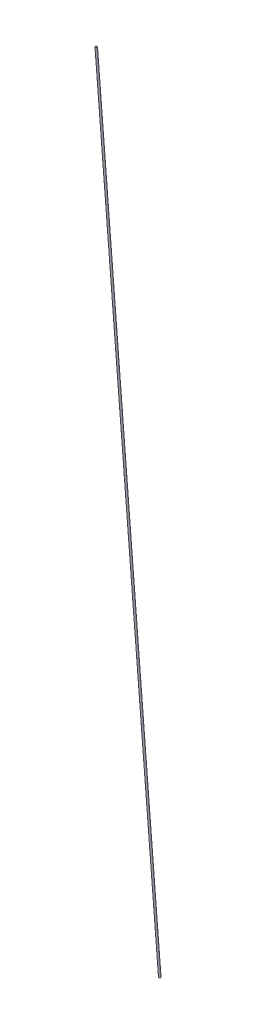
ISO-10303-21;
HEADER;
FILE_DESCRIPTION(('STEP AP214'),'2;1');
FILE_NAME('part.step','',(''),(''),'','','');
FILE_SCHEMA(('AUTOMOTIVE_DESIGN { 1 0 10303 214 1 1 1 1 }'));
ENDSEC;
DATA;
#1=APPLICATION_CONTEXT('core data for automotive mechanical design processes');
#2=APPLICATION_PROTOCOL_DEFINITION('international standard','automotive_design',2000,#1);
#3=PRODUCT_CONTEXT('',#1,'mechanical');
#4=PRODUCT('Part','Part','',(#3));
#5=PRODUCT_RELATED_PRODUCT_CATEGORY('part','',(#4));
#6=PRODUCT_DEFINITION_FORMATION('','',#4);
#7=PRODUCT_DEFINITION_CONTEXT('part definition',#1,'design');
#8=PRODUCT_DEFINITION('design','',#6,#7);
#9=PRODUCT_DEFINITION_SHAPE('','',#8);
#10=(LENGTH_UNIT() NAMED_UNIT(*) SI_UNIT(.MILLI.,.METRE.));
#11=(NAMED_UNIT(*) PLANE_ANGLE_UNIT() SI_UNIT($,.RADIAN.));
#12=(NAMED_UNIT(*) SI_UNIT($,.STERADIAN.) SOLID_ANGLE_UNIT());
#13=UNCERTAINTY_MEASURE_WITH_UNIT(LENGTH_MEASURE(1.E-05),#10,'distance_accuracy_value','');
#14=(GEOMETRIC_REPRESENTATION_CONTEXT(3) GLOBAL_UNCERTAINTY_ASSIGNED_CONTEXT((#13)) GLOBAL_UNIT_ASSIGNED_CONTEXT((#10,
#11,#12)) REPRESENTATION_CONTEXT('',''));
#15=CARTESIAN_POINT('',(0.,0.,0.));
#16=DIRECTION('',(0.,0.,1.));
#17=DIRECTION('',(1.,0.,0.));
#18=AXIS2_PLACEMENT_3D('',#15,#16,#17);
#19=CARTESIAN_POINT('',(0.,0.,0.));
#20=DIRECTION('',(0.,1.,0.));
#21=DIRECTION('',(0.,0.,1.));
#22=AXIS2_PLACEMENT_3D('',#19,#20,#21);
#23=PLANE('',#22);
#24=CARTESIAN_POINT('',(0.,0.,0.));
#25=DIRECTION('',(0.,1.,0.));
#26=DIRECTION('',(0.,0.,1.));
#27=AXIS2_PLACEMENT_3D('',#24,#25,#26);
#28=CIRCLE('',#27,2.);
#29=CARTESIAN_POINT('',(0.,0.,2.));
#30=VERTEX_POINT('',#29);
#31=EDGE_CURVE('E44',#30,#30,#28,.T.);
#32=ORIENTED_EDGE('',*,*,#31,.T.);
#33=EDGE_LOOP('',(#32));
#34=FACE_BOUND('',#33,.T.);
#35=ADVANCED_FACE('F37',(#34),#23,.T.);
#36=CARTESIAN_POINT('',(141.,-1718.,0.));
#37=DIRECTION('',(0.,1.,0.));
#38=DIRECTION('',(0.,0.,1.));
#39=AXIS2_PLACEMENT_3D('',#36,#37,#38);
#40=PLANE('',#39);
#41=CARTESIAN_POINT('',(141.,-1718.,0.));
#42=DIRECTION('',(0.,1.,0.));
#43=DIRECTION('',(0.,0.,1.));
#44=AXIS2_PLACEMENT_3D('',#41,#42,#43);
#45=CIRCLE('',#44,2.);
#46=CARTESIAN_POINT('',(141.,-1718.,2.));
#47=VERTEX_POINT('',#46);
#48=EDGE_CURVE('E10',#47,#47,#45,.T.);
#49=ORIENTED_EDGE('',*,*,#48,.F.);
#50=EDGE_LOOP('',(#49));
#51=FACE_BOUND('',#50,.T.);
#52=ADVANCED_FACE('F54',(#51),#40,.F.);
#53=CARTESIAN_POINT('',(0.,0.,2.));
#54=CARTESIAN_POINT('',(141.,-1718.,2.));
#55=CARTESIAN_POINT('',(4.,0.,2.));
#56=CARTESIAN_POINT('',(145.,-1718.,2.));
#57=CARTESIAN_POINT('',(4.,0.,-2.));
#58=CARTESIAN_POINT('',(145.,-1718.,-2.));
#59=CARTESIAN_POINT('',(0.,0.,-2.));
#60=CARTESIAN_POINT('',(141.,-1718.,-2.));
#61=CARTESIAN_POINT('',(-4.,0.,-2.));
#62=CARTESIAN_POINT('',(137.,-1718.,-2.));
#63=CARTESIAN_POINT('',(-4.,0.,2.));
#64=CARTESIAN_POINT('',(137.,-1718.,2.));
#65=CARTESIAN_POINT('',(0.,0.,2.));
#66=CARTESIAN_POINT('',(141.,-1718.,2.));
#67=(BOUNDED_SURFACE() B_SPLINE_SURFACE(3,1,((#53,#54),(#55,#56),(#57,#58),(#59,#60),(#61,#62),
(#63,#64),(#65,#66)),.UNSPECIFIED.,.T.,.F.,.F.) B_SPLINE_SURFACE_WITH_KNOTS((4,3,4),(2,2),(0.,
0.5,1.),(0.,1.),.UNSPECIFIED.) GEOMETRIC_REPRESENTATION_ITEM() RATIONAL_B_SPLINE_SURFACE(((1.,
1.),(0.333333333333333,0.333333333333333),(0.333333333333333,0.333333333333333),(1.,1.),
(0.333333333333333,0.333333333333333),(0.333333333333333,0.333333333333333),(1.,1.))) REPRESENTATION_ITEM('') SURFACE());
#68=CARTESIAN_POINT('',(141.,-1718.,2.));
#69=CARTESIAN_POINT('',(139.53125,-1700.10416666667,2.));
#70=CARTESIAN_POINT('',(138.0625,-1682.20833333333,2.));
#71=CARTESIAN_POINT('',(135.125,-1646.41666666667,2.));
#72=CARTESIAN_POINT('',(133.65625,-1628.52083333333,2.));
#73=CARTESIAN_POINT('',(130.71875,-1592.72916666667,2.));
#74=CARTESIAN_POINT('',(129.25,-1574.83333333333,2.));
#75=CARTESIAN_POINT('',(126.3125,-1539.04166666667,2.));
#76=CARTESIAN_POINT('',(124.84375,-1521.14583333333,2.));
#77=CARTESIAN_POINT('',(121.90625,-1485.35416666667,2.));
#78=CARTESIAN_POINT('',(120.4375,-1467.45833333333,2.));
#79=CARTESIAN_POINT('',(117.5,-1431.66666666667,2.));
#80=CARTESIAN_POINT('',(116.03125,-1413.77083333333,2.));
#81=CARTESIAN_POINT('',(113.09375,-1377.97916666667,2.));
#82=CARTESIAN_POINT('',(111.625,-1360.08333333333,2.));
#83=CARTESIAN_POINT('',(108.6875,-1324.29166666667,2.));
#84=CARTESIAN_POINT('',(107.21875,-1306.39583333333,2.));
#85=CARTESIAN_POINT('',(104.28125,-1270.60416666667,2.));
#86=CARTESIAN_POINT('',(102.8125,-1252.70833333333,2.));
#87=CARTESIAN_POINT('',(99.8750000000002,-1216.91666666667,2.));
#88=CARTESIAN_POINT('',(98.4062500000002,-1199.02083333333,2.));
#89=CARTESIAN_POINT('',(95.4687500000002,-1163.22916666667,2.));
#90=CARTESIAN_POINT('',(94.0000000000002,-1145.33333333333,2.));
#91=CARTESIAN_POINT('',(91.0625000000001,-1109.54166666667,2.));
#92=CARTESIAN_POINT('',(89.5937500000001,-1091.64583333333,2.));
#93=CARTESIAN_POINT('',(86.6562500000001,-1055.85416666667,2.));
#94=CARTESIAN_POINT('',(85.1875000000002,-1037.95833333333,2.));
#95=CARTESIAN_POINT('',(82.2500000000001,-1002.16666666667,2.));
#96=CARTESIAN_POINT('',(80.7812500000001,-984.270833333333,2.));
#97=CARTESIAN_POINT('',(77.8437500000001,-948.479166666667,2.));
#98=CARTESIAN_POINT('',(76.3750000000001,-930.583333333333,2.));
#99=CARTESIAN_POINT('',(73.4375000000001,-894.791666666667,2.));
#100=CARTESIAN_POINT('',(71.9687500000001,-876.895833333333,2.));
#101=CARTESIAN_POINT('',(69.0312500000001,-841.104166666667,2.));
#102=CARTESIAN_POINT('',(67.5625000000001,-823.208333333333,2.));
#103=CARTESIAN_POINT('',(64.6250000000001,-787.416666666667,2.));
#104=CARTESIAN_POINT('',(63.1562500000001,-769.520833333333,2.));
#105=CARTESIAN_POINT('',(60.2187500000001,-733.729166666667,2.));
#106=CARTESIAN_POINT('',(58.7500000000001,-715.833333333333,2.));
#107=CARTESIAN_POINT('',(55.8125000000001,-680.041666666667,2.));
#108=CARTESIAN_POINT('',(54.3437500000001,-662.145833333333,2.));
#109=CARTESIAN_POINT('',(51.4062500000001,-626.354166666667,2.));
#110=CARTESIAN_POINT('',(49.9375000000001,-608.458333333333,2.));
#111=CARTESIAN_POINT('',(47.0000000000001,-572.666666666667,2.));
#112=CARTESIAN_POINT('',(45.5312500000001,-554.770833333333,2.));
#113=CARTESIAN_POINT('',(42.5937500000001,-518.979166666667,2.));
#114=CARTESIAN_POINT('',(41.1250000000001,-501.083333333333,2.));
#115=CARTESIAN_POINT('',(38.1875000000001,-465.291666666667,2.));
#116=CARTESIAN_POINT('',(36.7187500000001,-447.395833333333,2.));
#117=CARTESIAN_POINT('',(33.7812500000001,-411.604166666667,2.));
#118=CARTESIAN_POINT('',(32.3125000000001,-393.708333333333,2.));
#119=CARTESIAN_POINT('',(29.375,-357.916666666667,2.));
#120=CARTESIAN_POINT('',(27.90625,-340.020833333333,2.));
#121=CARTESIAN_POINT('',(24.96875,-304.229166666667,2.));
#122=CARTESIAN_POINT('',(23.5,-286.333333333333,2.));
#123=CARTESIAN_POINT('',(20.5625,-250.541666666667,2.));
#124=CARTESIAN_POINT('',(19.09375,-232.645833333333,2.));
#125=CARTESIAN_POINT('',(16.15625,-196.854166666667,2.));
#126=CARTESIAN_POINT('',(14.6875,-178.958333333333,2.));
#127=CARTESIAN_POINT('',(11.75,-143.166666666667,2.));
#128=CARTESIAN_POINT('',(10.28125,-125.270833333333,2.));
#129=CARTESIAN_POINT('',(7.34375000000001,-89.4791666666667,2.));
#130=CARTESIAN_POINT('',(5.87500000000001,-71.5833333333333,2.));
#131=CARTESIAN_POINT('',(2.93750000000001,-35.7916666666667,2.));
#132=CARTESIAN_POINT('',(1.46875,-17.8958333333333,2.));
#133=CARTESIAN_POINT('',(0.,0.,2.));
#134=B_SPLINE_CURVE_WITH_KNOTS('',3,(#68,#69,#70,#71,#72,#73,#74,#75,#76,#77,#78,#79,#80,#81,
#82,#83,#84,#85,#86,#87,#88,#89,#90,#91,#92,#93,#94,#95,#96,#97,#98,#99,#100,#101,#102,#103,
#104,#105,#106,#107,#108,#109,#110,#111,#112,#113,#114,#115,#116,#117,#118,#119,#120,#121,#122,
#123,#124,#125,#126,#127,#128,#129,#130,#131,#132,#133),.UNSPECIFIED.,.F.,.F.,(4,2,2,2,2,2,2,2,
2,2,2,2,2,2,2,2,2,2,2,2,2,2,2,2,2,2,2,2,2,2,2,2,4),(0.,53.8680118002559,107.736023600512,
161.604035400768,215.472047201023,269.340059001279,323.208070801535,377.076082601791,
430.944094402046,484.812106202302,538.680118002558,592.548129802814,646.41614160307,
700.284153403326,754.152165203581,808.020177003837,861.888188804093,915.756200604349,
969.624212404605,1023.49222420486,1077.36023600512,1131.22824780537,1185.09625960563,
1238.96427140588,1292.83228320614,1346.7002950064,1400.56830680665,1454.43631860691,
1508.30433040716,1562.17234220742,1616.04035400768,1669.90836580793,1723.77637760819),.UNSPECIFIED.);
#135=EDGE_CURVE('BSEAM52',#47,#30,#134,.T.);
#136=ORIENTED_EDGE('',*,*,#48,.T.);
#137=ORIENTED_EDGE('',*,*,#31,.F.);
#138=ORIENTED_EDGE('',*,*,#135,.T.);
#139=ORIENTED_EDGE('',*,*,#135,.F.);
#140=EDGE_LOOP('',(#136,#138,#137,#139));
#141=FACE_BOUND('',#140,.T.);
#142=ADVANCED_FACE('F52',(#141),#67,.F.);
#143=CLOSED_SHELL('',(#35,#52,#142));
#144=MANIFOLD_SOLID_BREP('B2',#143);
#145=ADVANCED_BREP_SHAPE_REPRESENTATION('',(#18,#144),#14);
#146=SHAPE_DEFINITION_REPRESENTATION(#9,#145);
ENDSEC;
END-ISO-10303-21;
